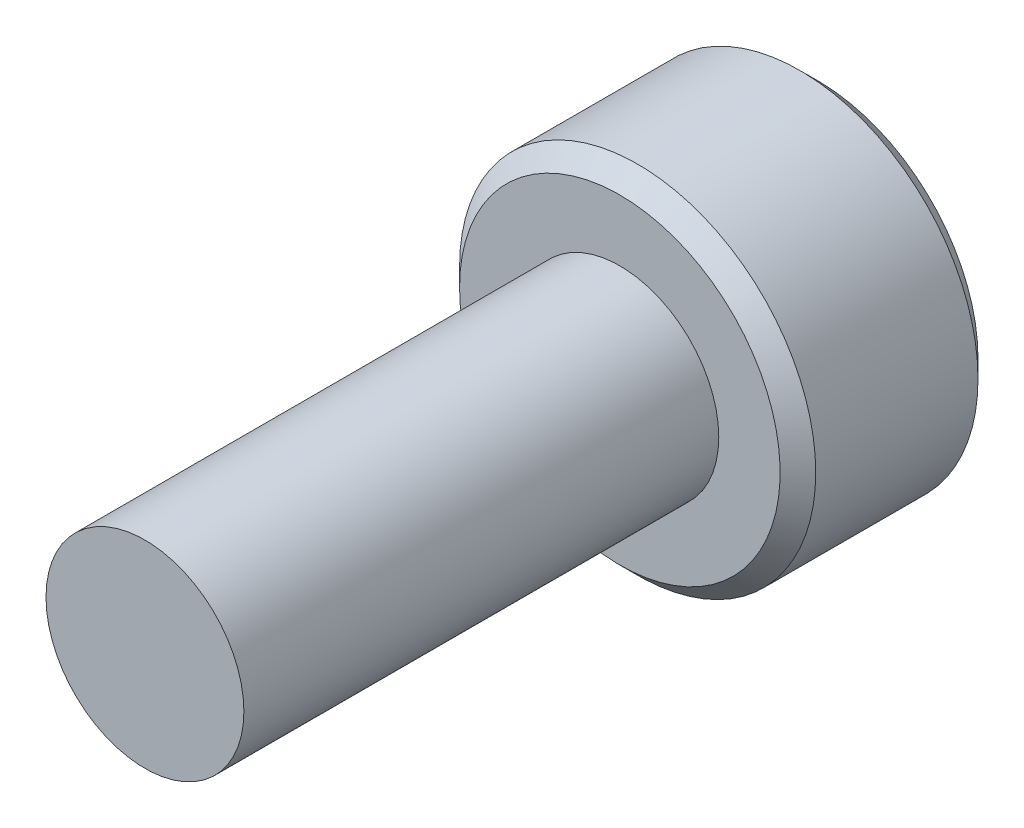
ISO-10303-21;
HEADER;
FILE_DESCRIPTION(('STEP AP214'),'2;1');
FILE_NAME('part.step','',(''),(''),'','','');
FILE_SCHEMA(('AUTOMOTIVE_DESIGN { 1 0 10303 214 1 1 1 1 }'));
ENDSEC;
DATA;
#1=APPLICATION_CONTEXT('core data for automotive mechanical design processes');
#2=APPLICATION_PROTOCOL_DEFINITION('international standard','automotive_design',2000,#1);
#3=PRODUCT_CONTEXT('',#1,'mechanical');
#4=PRODUCT('Part','Part','',(#3));
#5=PRODUCT_RELATED_PRODUCT_CATEGORY('part','',(#4));
#6=PRODUCT_DEFINITION_FORMATION('','',#4);
#7=PRODUCT_DEFINITION_CONTEXT('part definition',#1,'design');
#8=PRODUCT_DEFINITION('design','',#6,#7);
#9=PRODUCT_DEFINITION_SHAPE('','',#8);
#10=(LENGTH_UNIT() NAMED_UNIT(*) SI_UNIT(.MILLI.,.METRE.));
#11=(NAMED_UNIT(*) PLANE_ANGLE_UNIT() SI_UNIT($,.RADIAN.));
#12=(NAMED_UNIT(*) SI_UNIT($,.STERADIAN.) SOLID_ANGLE_UNIT());
#13=UNCERTAINTY_MEASURE_WITH_UNIT(LENGTH_MEASURE(1.E-05),#10,'distance_accuracy_value','');
#14=(GEOMETRIC_REPRESENTATION_CONTEXT(3) GLOBAL_UNCERTAINTY_ASSIGNED_CONTEXT((#13)) GLOBAL_UNIT_ASSIGNED_CONTEXT((#10,
#11,#12)) REPRESENTATION_CONTEXT('',''));
#15=CARTESIAN_POINT('',(0.,0.,0.));
#16=DIRECTION('',(0.,0.,1.));
#17=DIRECTION('',(1.,0.,0.));
#18=AXIS2_PLACEMENT_3D('',#15,#16,#17);
#19=CARTESIAN_POINT('',(0.,0.,-6.));
#20=DIRECTION('',(0.,0.,1.));
#21=DIRECTION('',(1.,0.,0.));
#22=AXIS2_PLACEMENT_3D('',#19,#20,#21);
#23=CYLINDRICAL_SURFACE('',#22,1.25);
#24=CARTESIAN_POINT('',(0.,0.,-6.));
#25=DIRECTION('',(0.,0.,-1.));
#26=DIRECTION('',(-1.,0.,0.));
#27=AXIS2_PLACEMENT_3D('',#24,#25,#26);
#28=CIRCLE('',#27,1.25);
#29=CARTESIAN_POINT('',(-1.25,0.,-6.));
#30=VERTEX_POINT('',#29);
#31=EDGE_CURVE('E208',#30,#30,#28,.F.);
#32=ORIENTED_EDGE('',*,*,#31,.T.);
#33=EDGE_LOOP('',(#32));
#34=FACE_BOUND('',#33,.T.);
#35=CARTESIAN_POINT('',(0.,0.,0.));
#36=DIRECTION('',(0.,0.,1.));
#37=DIRECTION('',(1.,0.,0.));
#38=AXIS2_PLACEMENT_3D('',#35,#36,#37);
#39=CIRCLE('',#38,1.25);
#40=CARTESIAN_POINT('',(1.25,0.,0.));
#41=VERTEX_POINT('',#40);
#42=EDGE_CURVE('E111',#41,#41,#39,.T.);
#43=ORIENTED_EDGE('',*,*,#42,.F.);
#44=EDGE_LOOP('',(#43));
#45=FACE_BOUND('',#44,.T.);
#46=ADVANCED_FACE('F37',(#34,#45),#23,.T.);
#47=CARTESIAN_POINT('',(0.,0.,0.));
#48=DIRECTION('',(0.,0.,1.));
#49=DIRECTION('',(1.,0.,0.));
#50=AXIS2_PLACEMENT_3D('',#47,#48,#49);
#51=PLANE('',#50);
#52=ORIENTED_EDGE('',*,*,#42,.T.);
#53=EDGE_LOOP('',(#52));
#54=FACE_BOUND('',#53,.T.);
#55=ADVANCED_FACE('F195',(#54),#51,.T.);
#56=CARTESIAN_POINT('',(0.,0.,-8.5));
#57=DIRECTION('',(0.,0.,1.));
#58=DIRECTION('',(1.,0.,0.));
#59=AXIS2_PLACEMENT_3D('',#56,#57,#58);
#60=CYLINDRICAL_SURFACE('',#59,2.25);
#61=CARTESIAN_POINT('',(0.,0.,-8.275));
#62=DIRECTION('',(0.,0.,-1.));
#63=DIRECTION('',(-1.,0.,0.));
#64=AXIS2_PLACEMENT_3D('',#61,#62,#63);
#65=CIRCLE('',#64,2.25);
#66=CARTESIAN_POINT('',(2.25,0.,-8.275));
#67=VERTEX_POINT('',#66);
#68=EDGE_CURVE('E45',#67,#67,#65,.F.);
#69=ORIENTED_EDGE('',*,*,#68,.T.);
#70=EDGE_LOOP('',(#69));
#71=FACE_BOUND('',#70,.T.);
#72=CARTESIAN_POINT('',(0.,0.,-6.225));
#73=DIRECTION('',(0.,0.,-1.));
#74=DIRECTION('',(-1.,0.,0.));
#75=AXIS2_PLACEMENT_3D('',#72,#73,#74);
#76=CIRCLE('',#75,2.25);
#77=CARTESIAN_POINT('',(-2.25,0.,-6.225));
#78=VERTEX_POINT('',#77);
#79=EDGE_CURVE('E174',#78,#78,#76,.T.);
#80=ORIENTED_EDGE('',*,*,#79,.T.);
#81=EDGE_LOOP('',(#80));
#82=FACE_BOUND('',#81,.T.);
#83=ADVANCED_FACE('F179',(#71,#82),#60,.T.);
#84=CARTESIAN_POINT('',(0.,0.,-8.5));
#85=DIRECTION('',(0.,0.,-1.));
#86=DIRECTION('',(-1.,0.,0.));
#87=AXIS2_PLACEMENT_3D('',#84,#85,#86);
#88=PLANE('',#87);
#89=CARTESIAN_POINT('',(0.,0.,-8.5));
#90=DIRECTION('',(0.,0.,-1.));
#91=DIRECTION('',(-1.,0.,0.));
#92=AXIS2_PLACEMENT_3D('',#89,#90,#91);
#93=CIRCLE('',#92,2.025);
#94=CARTESIAN_POINT('',(2.025,0.,-8.5));
#95=VERTEX_POINT('',#94);
#96=EDGE_CURVE('E110',#95,#95,#93,.T.);
#97=ORIENTED_EDGE('',*,*,#96,.T.);
#98=EDGE_LOOP('',(#97));
#99=FACE_BOUND('',#98,.T.);
#100=CARTESIAN_POINT('',(0.,0.,-8.5));
#101=DIRECTION('',(0.,0.,-1.));
#102=DIRECTION('',(-1.,0.,0.));
#103=AXIS2_PLACEMENT_3D('',#100,#101,#102);
#104=CIRCLE('',#103,1.15470053837925);
#105=CARTESIAN_POINT('',(-1.,0.577350269189626,-8.5));
#106=VERTEX_POINT('',#105);
#107=CARTESIAN_POINT('',(0.,1.15470053837925,-8.5));
#108=VERTEX_POINT('',#107);
#109=EDGE_CURVE('E91',#106,#108,#104,.T.);
#110=ORIENTED_EDGE('',*,*,#109,.F.);
#111=CARTESIAN_POINT('',(-1.,-0.577350269189626,-8.5));
#112=VERTEX_POINT('',#111);
#113=EDGE_CURVE('E51',#112,#106,#104,.T.);
#114=ORIENTED_EDGE('',*,*,#113,.F.);
#115=CARTESIAN_POINT('',(0.,-1.15470053837925,-8.5));
#116=VERTEX_POINT('',#115);
#117=EDGE_CURVE('E267',#116,#112,#104,.T.);
#118=ORIENTED_EDGE('',*,*,#117,.F.);
#119=CARTESIAN_POINT('',(1.,-0.577350269189626,-8.5));
#120=VERTEX_POINT('',#119);
#121=EDGE_CURVE('E58',#120,#116,#104,.T.);
#122=ORIENTED_EDGE('',*,*,#121,.F.);
#123=CARTESIAN_POINT('',(1.,0.577350269189626,-8.5));
#124=VERTEX_POINT('',#123);
#125=EDGE_CURVE('E132',#124,#120,#104,.T.);
#126=ORIENTED_EDGE('',*,*,#125,.F.);
#127=EDGE_CURVE('E100',#108,#124,#104,.T.);
#128=ORIENTED_EDGE('',*,*,#127,.F.);
#129=EDGE_LOOP('',(#110,#114,#118,#122,#126,#128));
#130=FACE_BOUND('',#129,.T.);
#131=ADVANCED_FACE('F131',(#99,#130),#88,.T.);
#132=CARTESIAN_POINT('',(0.,0.,-6.));
#133=DIRECTION('',(0.,0.,-1.));
#134=DIRECTION('',(-1.,0.,0.));
#135=AXIS2_PLACEMENT_3D('',#132,#133,#134);
#136=PLANE('',#135);
#137=CARTESIAN_POINT('',(0.,0.,-6.));
#138=DIRECTION('',(0.,0.,-1.));
#139=DIRECTION('',(-1.,0.,0.));
#140=AXIS2_PLACEMENT_3D('',#137,#138,#139);
#141=CIRCLE('',#140,2.025);
#142=CARTESIAN_POINT('',(-2.025,0.,-6.));
#143=VERTEX_POINT('',#142);
#144=EDGE_CURVE('E11',#143,#143,#141,.F.);
#145=ORIENTED_EDGE('',*,*,#144,.T.);
#146=EDGE_LOOP('',(#145));
#147=FACE_BOUND('',#146,.T.);
#148=ORIENTED_EDGE('',*,*,#31,.F.);
#149=EDGE_LOOP('',(#148));
#150=FACE_BOUND('',#149,.T.);
#151=ADVANCED_FACE('F188',(#147,#150),#136,.F.);
#152=CARTESIAN_POINT('',(0.,0.,-8.5));
#153=DIRECTION('',(0.,0.,-1.));
#154=DIRECTION('',(-1.,0.,0.));
#155=AXIS2_PLACEMENT_3D('',#152,#153,#154);
#156=CONICAL_SURFACE('',#155,1.15470053837925,0.78539816339745);
#157=ORIENTED_EDGE('',*,*,#127,.T.);
#158=CARTESIAN_POINT('',(-0.000200000000000231,1.15481600843309,-8.50011548737262));
#159=CARTESIAN_POINT('',(0.0341825950071802,1.13496520795026,-8.48027793082573));
#160=CARTESIAN_POINT('',(0.0691401181398241,1.11478247255942,-8.46160502063889));
#161=CARTESIAN_POINT('',(0.140422802956089,1.07362739529219,-8.42741474272316));
#162=CARTESIAN_POINT('',(0.176754750528984,1.0526511355808,-8.41191640902346));
#163=CARTESIAN_POINT('',(0.250016613803311,1.01035337909803,-8.38536730714227));
#164=CARTESIAN_POINT('',(0.286927851445414,0.989042666109241,-8.37424977399693));
#165=CARTESIAN_POINT('',(0.361562729310859,0.945952199282691,-8.35711986577618));
#166=CARTESIAN_POINT('',(0.399284088108636,0.924173762626596,-8.35109469746667));
#167=CARTESIAN_POINT('',(0.464292198417934,0.886641312640014,-8.34566055496749));
#168=CARTESIAN_POINT('',(0.491494371528172,0.870936130672275,-8.34485693831673));
#169=CARTESIAN_POINT('',(0.545846040669112,0.839556179862848,-8.34620669941689));
#170=CARTESIAN_POINT('',(0.572995523754876,0.823881418494923,-8.3483607295472));
#171=CARTESIAN_POINT('',(0.654056277326961,0.777080970599366,-8.35911697212847));
#172=CARTESIAN_POINT('',(0.707564140978428,0.74618819111643,-8.37201455641536));
#173=CARTESIAN_POINT('',(0.801476065143432,0.691968116419649,-8.40314073060218));
#174=CARTESIAN_POINT('',(0.842320523671835,0.668386557293371,-8.41973779770184));
#175=CARTESIAN_POINT('',(0.922409637381944,0.622147085933681,-8.45712492468529));
#176=CARTESIAN_POINT('',(0.961659010870438,0.599486449584575,-8.4779013418174));
#177=CARTESIAN_POINT('',(1.0002,0.577234799135788,-8.50011548737262));
#178=B_SPLINE_CURVE_WITH_KNOTS('',3,(#158,#159,#160,#161,#162,#163,#164,#165,#166,#167,#168,
#169,#170,#171,#172,#173,#174,#175,#176,#177),.UNSPECIFIED.,.F.,.F.,(4,2,2,2,2,2,2,2,2,4),(0.,
0.133237676828558,0.26725222983449,0.3991370762693,0.530689603280769,0.624814864263847,
0.718960890149134,0.907306626112098,1.0571010036179,1.20641411519286),.UNSPECIFIED.);
#179=EDGE_CURVE('E105',#108,#124,#178,.T.);
#180=ORIENTED_EDGE('',*,*,#179,.F.);
#181=EDGE_LOOP('',(#157,#180));
#182=FACE_BOUND('',#181,.T.);
#183=ADVANCED_FACE('F106',(#182),#156,.F.);
#184=ORIENTED_EDGE('',*,*,#125,.T.);
#185=CARTESIAN_POINT('',(1.,-1.15147208646462,-8.87038567751386));
#186=CARTESIAN_POINT('',(1.,-1.12343447988552,-8.84921991987371));
#187=CARTESIAN_POINT('',(1.,-1.09524064850697,-8.82826169217591));
#188=CARTESIAN_POINT('',(1.,-1.03847715644376,-8.78684602223562));
#189=CARTESIAN_POINT('',(1.,-1.00990740382975,-8.76638870612366));
#190=CARTESIAN_POINT('',(1.,-0.923120894333477,-8.70560479495451));
#191=CARTESIAN_POINT('',(1.,-0.86425317375906,-8.6661922289614));
#192=CARTESIAN_POINT('',(1.,-0.740809858258045,-8.58882066420021));
#193=CARTESIAN_POINT('',(1.,-0.676100255137806,-8.55107303911434));
#194=CARTESIAN_POINT('',(1.,-0.543448939049123,-8.48202458755129));
#195=CARTESIAN_POINT('',(1.,-0.475519112027778,-8.45070202784687));
#196=CARTESIAN_POINT('',(1.,-0.373555850333528,-8.4123817788838));
#197=CARTESIAN_POINT('',(1.,-0.341031989670907,-8.40138359164216));
#198=CARTESIAN_POINT('',(1.,-0.275199079052293,-8.38199834214736));
#199=CARTESIAN_POINT('',(1.,-0.241889975173933,-8.3736114597767));
#200=CARTESIAN_POINT('',(1.,-0.175247517042993,-8.36002522071902));
#201=CARTESIAN_POINT('',(1.,-0.141925568218175,-8.35477079076797));
#202=CARTESIAN_POINT('',(1.,-0.0749144362322793,-8.34754868657089));
#203=CARTESIAN_POINT('',(1.,-0.0412251978501623,-8.34558151361051));
#204=CARTESIAN_POINT('',(1.,0.0249580992634204,-8.34508319839316));
#205=CARTESIAN_POINT('',(1.,0.0574512826460387,-8.34643026788864));
#206=CARTESIAN_POINT('',(1.,0.122148505701866,-8.35221648449898));
#207=CARTESIAN_POINT('',(1.,0.154352610132926,-8.35665492066154));
#208=CARTESIAN_POINT('',(1.,0.218799898867639,-8.3684568301452));
#209=CARTESIAN_POINT('',(1.,0.251033743268953,-8.37587054103851));
#210=CARTESIAN_POINT('',(1.,0.314797132354918,-8.39322894249868));
#211=CARTESIAN_POINT('',(1.,0.346326735731004,-8.40317342128883));
#212=CARTESIAN_POINT('',(1.,0.445594187730203,-8.43822348255434));
#213=CARTESIAN_POINT('',(1.,0.511919139476035,-8.46732085835672));
#214=CARTESIAN_POINT('',(1.,0.64145324465753,-8.5320153296865));
#215=CARTESIAN_POINT('',(1.,0.704650133126342,-8.56763577671524));
#216=CARTESIAN_POINT('',(1.,0.825428490174983,-8.64112390134693));
#217=CARTESIAN_POINT('',(1.,0.883132947867681,-8.67879194713546));
#218=CARTESIAN_POINT('',(1.,0.968148853704562,-8.73702285294316));
#219=CARTESIAN_POINT('',(1.,0.996120570380282,-8.75663847576286));
#220=CARTESIAN_POINT('',(1.,1.05168177729901,-8.79638851706127));
#221=CARTESIAN_POINT('',(1.,1.079271369977,-8.81652279219883));
#222=CARTESIAN_POINT('',(1.,1.10670185346329,-8.83687211907297));
#223=B_SPLINE_CURVE_WITH_KNOTS('',3,(#185,#186,#187,#188,#189,#190,#191,#192,#193,#194,#195,
#196,#197,#198,#199,#200,#201,#202,#203,#204,#205,#206,#207,#208,#209,#210,#211,#212,#213,#214,
#215,#216,#217,#218,#219,#220,#221,#222),.UNSPECIFIED.,.F.,.F.,(4,2,2,2,2,2,2,2,2,2,2,2,2,2,2,2,
2,2,4),(0.,0.10538645908329,0.210799187330123,0.423233611565469,0.647793540908504,
0.87158087773861,0.974493074181421,1.07741235827201,1.17846428203205,1.27953161415762,
1.3769408673961,1.47432772585408,1.57343322804293,1.67253043972851,1.88917353996827,
2.10660791038813,2.31323734249843,2.41572589232044,2.51818641476503),.UNSPECIFIED.);
#224=EDGE_CURVE('E99',#124,#120,#223,.F.);
#225=ORIENTED_EDGE('',*,*,#224,.F.);
#226=EDGE_LOOP('',(#184,#225));
#227=FACE_BOUND('',#226,.T.);
#228=ADVANCED_FACE('F273',(#227),#156,.F.);
#229=ORIENTED_EDGE('',*,*,#121,.T.);
#230=CARTESIAN_POINT('',(1.0002,-0.577234799135788,-8.50011548737262));
#231=CARTESIAN_POINT('',(0.965817404992819,-0.597085599618622,-8.48027793082573));
#232=CARTESIAN_POINT('',(0.930859881860175,-0.617268335009456,-8.46160502063889));
#233=CARTESIAN_POINT('',(0.85957719704391,-0.658423412276686,-8.42741474272316));
#234=CARTESIAN_POINT('',(0.823245249471016,-0.67939967198808,-8.41191640902346));
#235=CARTESIAN_POINT('',(0.749983386196688,-0.721697428470847,-8.38536730714227));
#236=CARTESIAN_POINT('',(0.713072148554585,-0.743008141459637,-8.37424977399693));
#237=CARTESIAN_POINT('',(0.63843727068914,-0.786098608286187,-8.35711986577618));
#238=CARTESIAN_POINT('',(0.600715911891363,-0.807877044942282,-8.35109469746667));
#239=CARTESIAN_POINT('',(0.535707801582066,-0.845409494928863,-8.34566055496749));
#240=CARTESIAN_POINT('',(0.508505628471827,-0.861114676896602,-8.34485693831673));
#241=CARTESIAN_POINT('',(0.454153959330887,-0.89249462770603,-8.34620669941689));
#242=CARTESIAN_POINT('',(0.427004476245123,-0.908169389073954,-8.3483607295472));
#243=CARTESIAN_POINT('',(0.345943722673039,-0.954969836969511,-8.35911697212847));
#244=CARTESIAN_POINT('',(0.292435859021571,-0.985862616452448,-8.37201455641536));
#245=CARTESIAN_POINT('',(0.198523934856567,-1.04008269114923,-8.40314073060218));
#246=CARTESIAN_POINT('',(0.157679476328165,-1.06366425027551,-8.41973779770184));
#247=CARTESIAN_POINT('',(0.0775903626180557,-1.1099037216352,-8.4571249246853));
#248=CARTESIAN_POINT('',(0.0383409891295619,-1.1325643579843,-8.47790134181741));
#249=CARTESIAN_POINT('',(-0.000200000000000337,-1.15481600843309,-8.50011548737262));
#250=B_SPLINE_CURVE_WITH_KNOTS('',3,(#230,#231,#232,#233,#234,#235,#236,#237,#238,#239,#240,
#241,#242,#243,#244,#245,#246,#247,#248,#249),.UNSPECIFIED.,.F.,.F.,(4,2,2,2,2,2,2,2,2,4),(0.,
0.13323767682856,0.267252229834491,0.399137076269301,0.53068960328077,0.624814864263847,
0.718960890149134,0.907306626112099,1.0571010036179,1.20641411519286),.UNSPECIFIED.);
#251=EDGE_CURVE('E142',#120,#116,#250,.T.);
#252=ORIENTED_EDGE('',*,*,#251,.F.);
#253=EDGE_LOOP('',(#229,#252));
#254=FACE_BOUND('',#253,.T.);
#255=ADVANCED_FACE('F270',(#254),#156,.F.);
#256=ORIENTED_EDGE('',*,*,#117,.T.);
#257=CARTESIAN_POINT('',(0.000200000000000252,-1.15481600843309,-8.50011548737262));
#258=CARTESIAN_POINT('',(-0.03418259500718,-1.13496520795026,-8.48027793082573));
#259=CARTESIAN_POINT('',(-0.069140118139824,-1.11478247255942,-8.46160502063889));
#260=CARTESIAN_POINT('',(-0.140422802956089,-1.07362739529219,-8.42741474272316));
#261=CARTESIAN_POINT('',(-0.176754750528984,-1.0526511355808,-8.41191640902346));
#262=CARTESIAN_POINT('',(-0.250016613803311,-1.01035337909803,-8.38536730714227));
#263=CARTESIAN_POINT('',(-0.286927851445414,-0.989042666109241,-8.37424977399693));
#264=CARTESIAN_POINT('',(-0.361562729310859,-0.945952199282691,-8.35711986577618));
#265=CARTESIAN_POINT('',(-0.399284088108636,-0.924173762626596,-8.35109469746667));
#266=CARTESIAN_POINT('',(-0.464292198417934,-0.886641312640014,-8.34566055496749));
#267=CARTESIAN_POINT('',(-0.491494371528173,-0.870936130672275,-8.34485693831673));
#268=CARTESIAN_POINT('',(-0.545846040669113,-0.839556179862848,-8.34620669941689));
#269=CARTESIAN_POINT('',(-0.572995523754876,-0.823881418494923,-8.3483607295472));
#270=CARTESIAN_POINT('',(-0.654056277326961,-0.777080970599366,-8.35911697212847));
#271=CARTESIAN_POINT('',(-0.707564140978428,-0.74618819111643,-8.37201455641536));
#272=CARTESIAN_POINT('',(-0.801476065143432,-0.691968116419649,-8.40314073060218));
#273=CARTESIAN_POINT('',(-0.842320523671835,-0.668386557293371,-8.41973779770184));
#274=CARTESIAN_POINT('',(-0.922409637381944,-0.622147085933681,-8.45712492468529));
#275=CARTESIAN_POINT('',(-0.961659010870438,-0.599486449584575,-8.4779013418174));
#276=CARTESIAN_POINT('',(-1.0002,-0.577234799135788,-8.50011548737262));
#277=B_SPLINE_CURVE_WITH_KNOTS('',3,(#257,#258,#259,#260,#261,#262,#263,#264,#265,#266,#267,
#268,#269,#270,#271,#272,#273,#274,#275,#276),.UNSPECIFIED.,.F.,.F.,(4,2,2,2,2,2,2,2,2,4),(0.,
0.133237676828558,0.26725222983449,0.3991370762693,0.530689603280769,0.624814864263847,
0.718960890149134,0.907306626112099,1.0571010036179,1.20641411519286),.UNSPECIFIED.);
#278=EDGE_CURVE('E244',#116,#112,#277,.T.);
#279=ORIENTED_EDGE('',*,*,#278,.F.);
#280=EDGE_LOOP('',(#256,#279));
#281=FACE_BOUND('',#280,.T.);
#282=ADVANCED_FACE('F269',(#281),#156,.F.);
#283=ORIENTED_EDGE('',*,*,#113,.T.);
#284=CARTESIAN_POINT('',(-1.,-1.15147208663215,-8.87038567764035));
#285=CARTESIAN_POINT('',(-1.,-1.12343448004835,-8.84921991999533));
#286=CARTESIAN_POINT('',(-1.,-1.09524064866509,-8.82826169229267));
#287=CARTESIAN_POINT('',(-1.,-1.0384771565924,-8.78684602234268));
#288=CARTESIAN_POINT('',(-1.,-1.00990740397363,-8.76638870622588));
#289=CARTESIAN_POINT('',(-1.,-0.923120894462776,-8.70560479504213));
#290=CARTESIAN_POINT('',(-1.,-0.864253173878446,-8.66619222903932));
#291=CARTESIAN_POINT('',(-1.,-0.740809858355812,-8.58882066425819));
#292=CARTESIAN_POINT('',(-1.,-0.67610025522381,-8.55107303916216));
#293=CARTESIAN_POINT('',(-1.,-0.543448939110598,-8.48202458758025));
#294=CARTESIAN_POINT('',(-1.,-0.475519112076496,-8.45070202786713));
#295=CARTESIAN_POINT('',(-1.,-0.373555850372649,-8.4123817788976));
#296=CARTESIAN_POINT('',(-1.,-0.341031989714047,-8.40138359165622));
#297=CARTESIAN_POINT('',(-1.,-0.275199079103602,-8.38199834216111));
#298=CARTESIAN_POINT('',(-1.,-0.241889975229392,-8.37361145978989));
#299=CARTESIAN_POINT('',(-1.,-0.175247517106614,-8.36002522073014));
#300=CARTESIAN_POINT('',(-1.,-0.141925568285807,-8.35477079077761));
#301=CARTESIAN_POINT('',(-1.,-0.0749144363078002,-8.34754868657668));
#302=CARTESIAN_POINT('',(-1.,-0.0412251979295619,-8.34558151361391));
#303=CARTESIAN_POINT('',(-1.,0.024958099176865,-8.34508319839111));
#304=CARTESIAN_POINT('',(-1.,0.0574512825561965,-8.34643026788357));
#305=CARTESIAN_POINT('',(-1.,0.122148505605779,-8.35221648448742));
#306=CARTESIAN_POINT('',(-1.,0.154352610033881,-8.35665492064649));
#307=CARTESIAN_POINT('',(-1.,0.218799898762755,-8.36845683012285));
#308=CARTESIAN_POINT('',(-1.,0.251033743161197,-8.37587054101231));
#309=CARTESIAN_POINT('',(-1.,0.314797132241694,-8.39322894246471));
#310=CARTESIAN_POINT('',(-1.,0.346326735615184,-8.40317342125094));
#311=CARTESIAN_POINT('',(-1.,0.445594187589165,-8.43822348249794));
#312=CARTESIAN_POINT('',(-1.,0.511919139313635,-8.4673208582833));
#313=CARTESIAN_POINT('',(-1.,0.64145324445405,-8.53201532957715));
#314=CARTESIAN_POINT('',(-1.,0.704650132903151,-8.56763577658696));
#315=CARTESIAN_POINT('',(-1.,0.825428489916357,-8.64112390118245));
#316=CARTESIAN_POINT('',(-1.,0.883132947593202,-8.67879194695385));
#317=CARTESIAN_POINT('',(-1.,0.968148853406642,-8.73702285273595));
#318=CARTESIAN_POINT('',(-1.,0.99612057007466,-8.75663847554718));
#319=CARTESIAN_POINT('',(-1.,1.05168177697804,-8.79638851682867));
#320=CARTESIAN_POINT('',(-1.,1.07927136964838,-8.81652279195778));
#321=CARTESIAN_POINT('',(-1.,1.10670185312703,-8.83687211882347));
#322=B_SPLINE_CURVE_WITH_KNOTS('',3,(#284,#285,#286,#287,#288,#289,#290,#291,#292,#293,#294,
#295,#296,#297,#298,#299,#300,#301,#302,#303,#304,#305,#306,#307,#308,#309,#310,#311,#312,#313,
#314,#315,#316,#317,#318,#319,#320,#321),.UNSPECIFIED.,.F.,.F.,(4,2,2,2,2,2,2,2,2,2,2,2,2,2,2,2,
2,2,4),(0.,0.105386459103349,0.210799187370247,0.423233611646472,0.647793541035351,
0.871580877910865,0.974493074342053,1.07741235842104,1.17846428216995,1.2795316142844,
1.37694086751269,1.47432772596047,1.57343322813835,1.67253043981296,1.88917353997386,
2.10660791031433,2.31323734235672,2.41572589214523,2.51818641455632),.UNSPECIFIED.);
#323=EDGE_CURVE('E121',#112,#106,#322,.T.);
#324=ORIENTED_EDGE('',*,*,#323,.F.);
#325=EDGE_LOOP('',(#283,#324));
#326=FACE_BOUND('',#325,.T.);
#327=ADVANCED_FACE('F282',(#326),#156,.F.);
#328=ORIENTED_EDGE('',*,*,#109,.T.);
#329=CARTESIAN_POINT('',(-1.0002,0.577234799135788,-8.50011548737262));
#330=CARTESIAN_POINT('',(-0.965817404992819,0.597085599618622,-8.48027793082573));
#331=CARTESIAN_POINT('',(-0.930859881860175,0.617268335009456,-8.46160502063889));
#332=CARTESIAN_POINT('',(-0.85957719704391,0.658423412276686,-8.42741474272316));
#333=CARTESIAN_POINT('',(-0.823245249471016,0.67939967198808,-8.41191640902346));
#334=CARTESIAN_POINT('',(-0.749983386196688,0.721697428470847,-8.38536730714227));
#335=CARTESIAN_POINT('',(-0.713072148554585,0.743008141459637,-8.37424977399693));
#336=CARTESIAN_POINT('',(-0.63843727068914,0.786098608286187,-8.35711986577618));
#337=CARTESIAN_POINT('',(-0.600715911891363,0.807877044942282,-8.35109469746667));
#338=CARTESIAN_POINT('',(-0.535707801582065,0.845409494928864,-8.34566055496749));
#339=CARTESIAN_POINT('',(-0.508505628471826,0.861114676896602,-8.34485693831673));
#340=CARTESIAN_POINT('',(-0.454153959330887,0.89249462770603,-8.34620669941689));
#341=CARTESIAN_POINT('',(-0.427004476245123,0.908169389073955,-8.3483607295472));
#342=CARTESIAN_POINT('',(-0.345943722673038,0.954969836969512,-8.35911697212847));
#343=CARTESIAN_POINT('',(-0.292435859021571,0.985862616452448,-8.37201455641536));
#344=CARTESIAN_POINT('',(-0.198523934856567,1.04008269114923,-8.40314073060218));
#345=CARTESIAN_POINT('',(-0.157679476328164,1.06366425027551,-8.41973779770184));
#346=CARTESIAN_POINT('',(-0.0775903626180554,1.1099037216352,-8.4571249246853));
#347=CARTESIAN_POINT('',(-0.0383409891295616,1.1325643579843,-8.47790134181741));
#348=CARTESIAN_POINT('',(0.000200000000000518,1.15481600843309,-8.50011548737262));
#349=B_SPLINE_CURVE_WITH_KNOTS('',3,(#329,#330,#331,#332,#333,#334,#335,#336,#337,#338,#339,
#340,#341,#342,#343,#344,#345,#346,#347,#348),.UNSPECIFIED.,.F.,.F.,(4,2,2,2,2,2,2,2,2,4),(0.,
0.13323767682856,0.267252229834491,0.399137076269301,0.53068960328077,0.624814864263848,
0.718960890149135,0.9073066261121,1.0571010036179,1.20641411519286),.UNSPECIFIED.);
#350=EDGE_CURVE('E95',#106,#108,#349,.T.);
#351=ORIENTED_EDGE('',*,*,#350,.F.);
#352=EDGE_LOOP('',(#328,#351));
#353=FACE_BOUND('',#352,.T.);
#354=ADVANCED_FACE('F93',(#353),#156,.F.);
#355=CARTESIAN_POINT('',(1.,1.73205080756888,-7.));
#356=DIRECTION('',(0.,0.,-1.));
#357=DIRECTION('',(-1.,0.,0.));
#358=AXIS2_PLACEMENT_3D('',#355,#356,#357);
#359=PLANE('',#358);
#360=DIRECTION('',(0.866025403784439,0.5,0.));
#361=VECTOR('',#360,1.);
#362=CARTESIAN_POINT('',(-1.,0.577350269189626,-7.));
#363=LINE('',#362,#361);
#364=CARTESIAN_POINT('',(-1.,0.577350269189626,-7.));
#365=VERTEX_POINT('',#364);
#366=CARTESIAN_POINT('',(0.,1.15470053837925,-7.));
#367=VERTEX_POINT('',#366);
#368=EDGE_CURVE('E120',#365,#367,#363,.T.);
#369=ORIENTED_EDGE('',*,*,#368,.T.);
#370=DIRECTION('',(0.866025403784439,-0.5,0.));
#371=VECTOR('',#370,1.);
#372=CARTESIAN_POINT('',(0.,1.15470053837925,-7.));
#373=LINE('',#372,#371);
#374=CARTESIAN_POINT('',(1.,0.577350269189626,-7.));
#375=VERTEX_POINT('',#374);
#376=EDGE_CURVE('E125',#367,#375,#373,.T.);
#377=ORIENTED_EDGE('',*,*,#376,.T.);
#378=DIRECTION('',(0.,-1.,0.));
#379=VECTOR('',#378,1.);
#380=CARTESIAN_POINT('',(1.,0.577350269189626,-7.));
#381=LINE('',#380,#379);
#382=CARTESIAN_POINT('',(1.,-0.577350269189626,-7.));
#383=VERTEX_POINT('',#382);
#384=EDGE_CURVE('E230',#375,#383,#381,.T.);
#385=ORIENTED_EDGE('',*,*,#384,.T.);
#386=DIRECTION('',(-0.866025403784439,-0.5,0.));
#387=VECTOR('',#386,1.);
#388=CARTESIAN_POINT('',(1.,-0.577350269189626,-7.));
#389=LINE('',#388,#387);
#390=CARTESIAN_POINT('',(0.,-1.15470053837925,-7.));
#391=VERTEX_POINT('',#390);
#392=EDGE_CURVE('E227',#383,#391,#389,.T.);
#393=ORIENTED_EDGE('',*,*,#392,.T.);
#394=DIRECTION('',(-0.866025403784439,0.5,0.));
#395=VECTOR('',#394,1.);
#396=CARTESIAN_POINT('',(0.,-1.15470053837925,-7.));
#397=LINE('',#396,#395);
#398=CARTESIAN_POINT('',(-1.,-0.577350269189626,-7.));
#399=VERTEX_POINT('',#398);
#400=EDGE_CURVE('E224',#391,#399,#397,.T.);
#401=ORIENTED_EDGE('',*,*,#400,.T.);
#402=DIRECTION('',(0.,1.,0.));
#403=VECTOR('',#402,1.);
#404=CARTESIAN_POINT('',(-1.,-0.577350269189626,-7.));
#405=LINE('',#404,#403);
#406=EDGE_CURVE('E128',#399,#365,#405,.T.);
#407=ORIENTED_EDGE('',*,*,#406,.T.);
#408=EDGE_LOOP('',(#369,#377,#385,#393,#401,#407));
#409=FACE_BOUND('',#408,.T.);
#410=ADVANCED_FACE('F162',(#409),#359,.T.);
#411=CARTESIAN_POINT('',(0.,1.15470053837925,-7.));
#412=DIRECTION('',(0.5,0.866025403784439,0.));
#413=DIRECTION('',(-0.866025403784439,0.5,0.));
#414=AXIS2_PLACEMENT_3D('',#411,#412,#413);
#415=PLANE('',#414);
#416=DIRECTION('',(0.,0.,-1.));
#417=VECTOR('',#416,1.);
#418=CARTESIAN_POINT('',(0.,1.15470053837925,-7.));
#419=LINE('',#418,#417);
#420=EDGE_CURVE('E117',#367,#108,#419,.T.);
#421=ORIENTED_EDGE('',*,*,#420,.T.);
#422=ORIENTED_EDGE('',*,*,#179,.T.);
#423=DIRECTION('',(0.,0.,-1.));
#424=VECTOR('',#423,1.);
#425=CARTESIAN_POINT('',(1.,0.577350269189626,-7.));
#426=LINE('',#425,#424);
#427=EDGE_CURVE('E127',#375,#124,#426,.T.);
#428=ORIENTED_EDGE('',*,*,#427,.F.);
#429=ORIENTED_EDGE('',*,*,#376,.F.);
#430=EDGE_LOOP('',(#421,#422,#428,#429));
#431=FACE_BOUND('',#430,.T.);
#432=ADVANCED_FACE('F123',(#431),#415,.F.);
#433=CARTESIAN_POINT('',(1.,0.577350269189626,-7.));
#434=DIRECTION('',(1.,0.,0.));
#435=DIRECTION('',(0.,0.,-1.));
#436=AXIS2_PLACEMENT_3D('',#433,#434,#435);
#437=PLANE('',#436);
#438=ORIENTED_EDGE('',*,*,#427,.T.);
#439=ORIENTED_EDGE('',*,*,#224,.T.);
#440=DIRECTION('',(0.,0.,-1.));
#441=VECTOR('',#440,1.);
#442=CARTESIAN_POINT('',(1.,-0.577350269189626,-7.));
#443=LINE('',#442,#441);
#444=EDGE_CURVE('E215',#383,#120,#443,.T.);
#445=ORIENTED_EDGE('',*,*,#444,.F.);
#446=ORIENTED_EDGE('',*,*,#384,.F.);
#447=EDGE_LOOP('',(#438,#439,#445,#446));
#448=FACE_BOUND('',#447,.T.);
#449=ADVANCED_FACE('F151',(#448),#437,.F.);
#450=CARTESIAN_POINT('',(1.,-0.577350269189626,-7.));
#451=DIRECTION('',(0.5,-0.866025403784439,0.));
#452=DIRECTION('',(0.866025403784439,0.5,0.));
#453=AXIS2_PLACEMENT_3D('',#450,#451,#452);
#454=PLANE('',#453);
#455=ORIENTED_EDGE('',*,*,#444,.T.);
#456=ORIENTED_EDGE('',*,*,#251,.T.);
#457=DIRECTION('',(0.,0.,-1.));
#458=VECTOR('',#457,1.);
#459=CARTESIAN_POINT('',(0.,-1.15470053837925,-7.));
#460=LINE('',#459,#458);
#461=EDGE_CURVE('E218',#391,#116,#460,.T.);
#462=ORIENTED_EDGE('',*,*,#461,.F.);
#463=ORIENTED_EDGE('',*,*,#392,.F.);
#464=EDGE_LOOP('',(#455,#456,#462,#463));
#465=FACE_BOUND('',#464,.T.);
#466=ADVANCED_FACE('F155',(#465),#454,.F.);
#467=CARTESIAN_POINT('',(0.,-1.15470053837925,-7.));
#468=DIRECTION('',(-0.5,-0.866025403784439,0.));
#469=DIRECTION('',(0.866025403784439,-0.5,0.));
#470=AXIS2_PLACEMENT_3D('',#467,#468,#469);
#471=PLANE('',#470);
#472=ORIENTED_EDGE('',*,*,#461,.T.);
#473=ORIENTED_EDGE('',*,*,#278,.T.);
#474=DIRECTION('',(0.,0.,-1.));
#475=VECTOR('',#474,1.);
#476=CARTESIAN_POINT('',(-1.,-0.577350269189626,-7.));
#477=LINE('',#476,#475);
#478=EDGE_CURVE('E211',#399,#112,#477,.T.);
#479=ORIENTED_EDGE('',*,*,#478,.F.);
#480=ORIENTED_EDGE('',*,*,#400,.F.);
#481=EDGE_LOOP('',(#472,#473,#479,#480));
#482=FACE_BOUND('',#481,.T.);
#483=ADVANCED_FACE('F252',(#482),#471,.F.);
#484=CARTESIAN_POINT('',(-1.,-0.577350269189626,-7.));
#485=DIRECTION('',(-1.,0.,0.));
#486=DIRECTION('',(0.,-1.,0.));
#487=AXIS2_PLACEMENT_3D('',#484,#485,#486);
#488=PLANE('',#487);
#489=ORIENTED_EDGE('',*,*,#478,.T.);
#490=ORIENTED_EDGE('',*,*,#323,.T.);
#491=DIRECTION('',(0.,0.,-1.));
#492=VECTOR('',#491,1.);
#493=CARTESIAN_POINT('',(-1.,0.577350269189626,-7.));
#494=LINE('',#493,#492);
#495=EDGE_CURVE('E119',#365,#106,#494,.T.);
#496=ORIENTED_EDGE('',*,*,#495,.F.);
#497=ORIENTED_EDGE('',*,*,#406,.F.);
#498=EDGE_LOOP('',(#489,#490,#496,#497));
#499=FACE_BOUND('',#498,.T.);
#500=ADVANCED_FACE('F249',(#499),#488,.F.);
#501=CARTESIAN_POINT('',(-1.,0.577350269189626,-7.));
#502=DIRECTION('',(-0.5,0.866025403784439,0.));
#503=DIRECTION('',(-0.866025403784439,-0.5,0.));
#504=AXIS2_PLACEMENT_3D('',#501,#502,#503);
#505=PLANE('',#504);
#506=ORIENTED_EDGE('',*,*,#495,.T.);
#507=ORIENTED_EDGE('',*,*,#350,.T.);
#508=ORIENTED_EDGE('',*,*,#420,.F.);
#509=ORIENTED_EDGE('',*,*,#368,.F.);
#510=EDGE_LOOP('',(#506,#507,#508,#509));
#511=FACE_BOUND('',#510,.T.);
#512=ADVANCED_FACE('F115',(#511),#505,.F.);
#513=CARTESIAN_POINT('',(0.,0.,-8.5));
#514=DIRECTION('',(0.,0.,1.));
#515=DIRECTION('',(1.,0.,0.));
#516=AXIS2_PLACEMENT_3D('',#513,#514,#515);
#517=CONICAL_SURFACE('',#516,2.025,0.785398163397443);
#518=CARTESIAN_POINT('',(2.25,0.,-8.275));
#519=CARTESIAN_POINT('',(2.24765625,0.,-8.27734375));
#520=CARTESIAN_POINT('',(2.2453125,0.,-8.2796875));
#521=CARTESIAN_POINT('',(2.240625,0.,-8.284375));
#522=CARTESIAN_POINT('',(2.23828125,0.,-8.28671875));
#523=CARTESIAN_POINT('',(2.23359375,0.,-8.29140625));
#524=CARTESIAN_POINT('',(2.23125,0.,-8.29375));
#525=CARTESIAN_POINT('',(2.2265625,0.,-8.2984375));
#526=CARTESIAN_POINT('',(2.22421875,0.,-8.30078125));
#527=CARTESIAN_POINT('',(2.21953125,0.,-8.30546875));
#528=CARTESIAN_POINT('',(2.2171875,0.,-8.3078125));
#529=CARTESIAN_POINT('',(2.2125,0.,-8.3125));
#530=CARTESIAN_POINT('',(2.21015625,0.,-8.31484375));
#531=CARTESIAN_POINT('',(2.20546875,0.,-8.31953125));
#532=CARTESIAN_POINT('',(2.203125,0.,-8.321875));
#533=CARTESIAN_POINT('',(2.1984375,0.,-8.3265625));
#534=CARTESIAN_POINT('',(2.19609375,0.,-8.32890625));
#535=CARTESIAN_POINT('',(2.19140625,0.,-8.33359375));
#536=CARTESIAN_POINT('',(2.1890625,0.,-8.3359375));
#537=CARTESIAN_POINT('',(2.184375,0.,-8.340625));
#538=CARTESIAN_POINT('',(2.18203125,0.,-8.34296875));
#539=CARTESIAN_POINT('',(2.17734375,0.,-8.34765625));
#540=CARTESIAN_POINT('',(2.175,0.,-8.35));
#541=CARTESIAN_POINT('',(2.1703125,0.,-8.3546875));
#542=CARTESIAN_POINT('',(2.16796875,0.,-8.35703125));
#543=CARTESIAN_POINT('',(2.16328125,0.,-8.36171875));
#544=CARTESIAN_POINT('',(2.1609375,0.,-8.3640625));
#545=CARTESIAN_POINT('',(2.15625,0.,-8.36875));
#546=CARTESIAN_POINT('',(2.15390625,0.,-8.37109375));
#547=CARTESIAN_POINT('',(2.14921875,0.,-8.37578125));
#548=CARTESIAN_POINT('',(2.146875,0.,-8.378125));
#549=CARTESIAN_POINT('',(2.1421875,0.,-8.3828125));
#550=CARTESIAN_POINT('',(2.13984375,0.,-8.38515625));
#551=CARTESIAN_POINT('',(2.13515625,0.,-8.38984375));
#552=CARTESIAN_POINT('',(2.1328125,0.,-8.3921875));
#553=CARTESIAN_POINT('',(2.128125,0.,-8.396875));
#554=CARTESIAN_POINT('',(2.12578125,0.,-8.39921875));
#555=CARTESIAN_POINT('',(2.12109375,0.,-8.40390625));
#556=CARTESIAN_POINT('',(2.11875,0.,-8.40625));
#557=CARTESIAN_POINT('',(2.1140625,0.,-8.4109375));
#558=CARTESIAN_POINT('',(2.11171875,0.,-8.41328125));
#559=CARTESIAN_POINT('',(2.10703125,0.,-8.41796875));
#560=CARTESIAN_POINT('',(2.1046875,0.,-8.4203125));
#561=CARTESIAN_POINT('',(2.1,0.,-8.425));
#562=CARTESIAN_POINT('',(2.09765625,0.,-8.42734375));
#563=CARTESIAN_POINT('',(2.09296875,0.,-8.43203125));
#564=CARTESIAN_POINT('',(2.090625,0.,-8.434375));
#565=CARTESIAN_POINT('',(2.0859375,0.,-8.4390625));
#566=CARTESIAN_POINT('',(2.08359375,0.,-8.44140625));
#567=CARTESIAN_POINT('',(2.07890625,0.,-8.44609375));
#568=CARTESIAN_POINT('',(2.0765625,0.,-8.4484375));
#569=CARTESIAN_POINT('',(2.071875,0.,-8.453125));
#570=CARTESIAN_POINT('',(2.06953125,0.,-8.45546875));
#571=CARTESIAN_POINT('',(2.06484375,0.,-8.46015625));
#572=CARTESIAN_POINT('',(2.0625,0.,-8.4625));
#573=CARTESIAN_POINT('',(2.0578125,0.,-8.4671875));
#574=CARTESIAN_POINT('',(2.05546875,0.,-8.46953125));
#575=CARTESIAN_POINT('',(2.05078125,0.,-8.47421875));
#576=CARTESIAN_POINT('',(2.0484375,0.,-8.4765625));
#577=CARTESIAN_POINT('',(2.04375,0.,-8.48125));
#578=CARTESIAN_POINT('',(2.04140625,0.,-8.48359375));
#579=CARTESIAN_POINT('',(2.03671875,0.,-8.48828125));
#580=CARTESIAN_POINT('',(2.034375,0.,-8.490625));
#581=CARTESIAN_POINT('',(2.0296875,0.,-8.4953125));
#582=CARTESIAN_POINT('',(2.02734375,0.,-8.49765625));
#583=CARTESIAN_POINT('',(2.025,0.,-8.5));
#584=B_SPLINE_CURVE_WITH_KNOTS('',3,(#518,#519,#520,#521,#522,#523,#524,#525,#526,#527,#528,
#529,#530,#531,#532,#533,#534,#535,#536,#537,#538,#539,#540,#541,#542,#543,#544,#545,#546,#547,
#548,#549,#550,#551,#552,#553,#554,#555,#556,#557,#558,#559,#560,#561,#562,#563,#564,#565,#566,
#567,#568,#569,#570,#571,#572,#573,#574,#575,#576,#577,#578,#579,#580,#581,#582,#583),
.UNSPECIFIED.,.F.,.F.,(4,2,2,2,2,2,2,2,2,2,2,2,2,2,2,2,2,2,2,2,2,2,2,2,2,2,2,2,2,2,2,2,4),(0.,
0.00994368911043657,0.0198873782208719,0.0298310673313082,0.0397747564417435,0.0497184455521801,
0.0596621346626154,0.069605823773052,0.0795495128834874,0.0894932019939239,0.099436891104359,
0.109380580214796,0.119324269325232,0.129267958435667,0.139211647546103,0.149155336656539,
0.159099025766974,0.169042714877411,0.178986403987846,0.188930093098283,0.198873782208718,
0.208817471319155,0.21876116042959,0.228704849540026,0.238648538650463,0.248592227760898,
0.258535916871335,0.26847960598177,0.278423295092207,0.288366984202642,0.298310673313078,
0.308254362423514,0.31819805153395),.UNSPECIFIED.);
#585=EDGE_CURVE('BSEAM182',#67,#95,#584,.T.);
#586=ORIENTED_EDGE('',*,*,#68,.F.);
#587=ORIENTED_EDGE('',*,*,#96,.F.);
#588=ORIENTED_EDGE('',*,*,#585,.T.);
#589=ORIENTED_EDGE('',*,*,#585,.F.);
#590=EDGE_LOOP('',(#586,#588,#587,#589));
#591=FACE_BOUND('',#590,.T.);
#592=ADVANCED_FACE('F182',(#591),#517,.T.);
#593=CARTESIAN_POINT('',(0.,0.,-6.225));
#594=DIRECTION('',(0.,0.,-1.));
#595=DIRECTION('',(-1.,0.,0.));
#596=AXIS2_PLACEMENT_3D('',#593,#594,#595);
#597=CONICAL_SURFACE('',#596,2.25,0.785398163397451);
#598=ORIENTED_EDGE('',*,*,#144,.F.);
#599=EDGE_LOOP('',(#598));
#600=FACE_BOUND('',#599,.T.);
#601=ORIENTED_EDGE('',*,*,#79,.F.);
#602=EDGE_LOOP('',(#601));
#603=FACE_BOUND('',#602,.T.);
#604=ADVANCED_FACE('F39',(#600,#603),#597,.T.);
#605=CLOSED_SHELL('',(#46,#55,#83,#131,#151,#183,#228,#255,#282,#327,#354,#410,#432,#449,#466,
#483,#500,#512,#592,#604));
#606=MANIFOLD_SOLID_BREP('B2',#605);
#607=ADVANCED_BREP_SHAPE_REPRESENTATION('',(#18,#606),#14);
#608=SHAPE_DEFINITION_REPRESENTATION(#9,#607);
ENDSEC;
END-ISO-10303-21;
